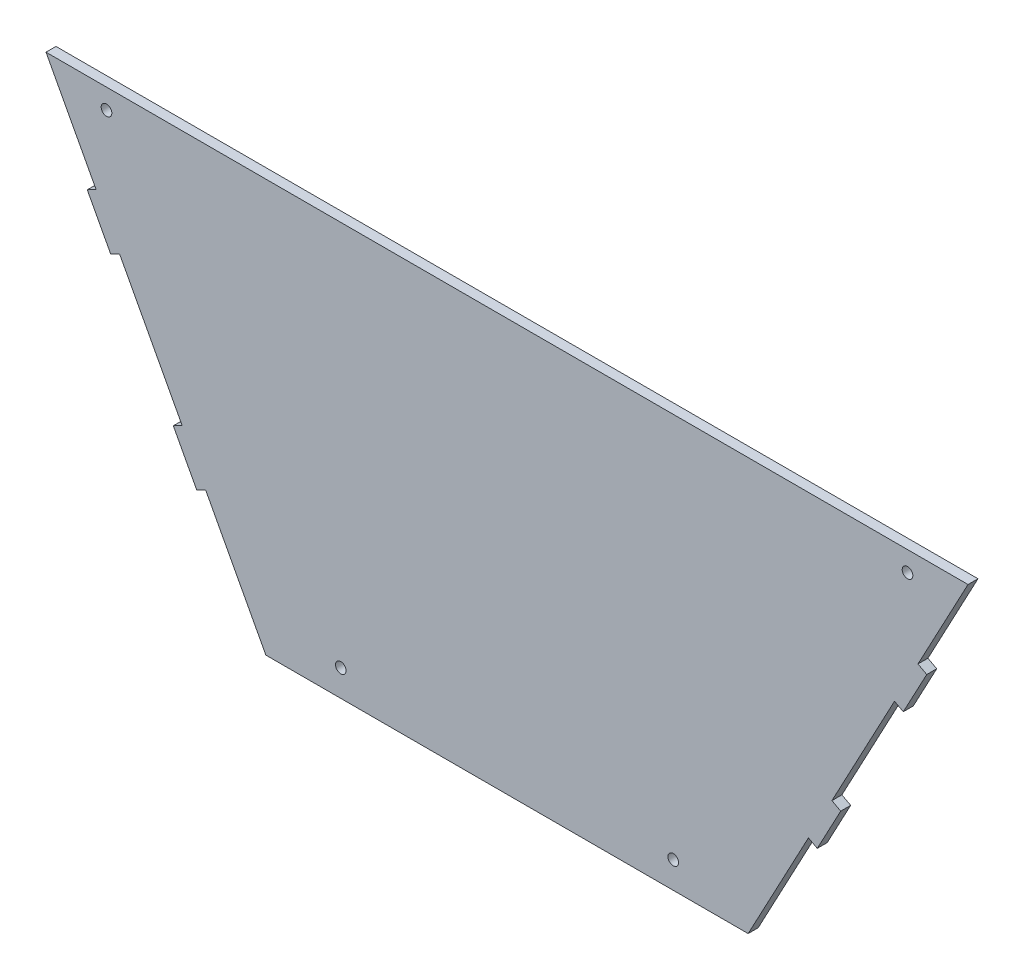
ISO-10303-21;
HEADER;
FILE_DESCRIPTION(('STEP AP214'),'2;1');
FILE_NAME('part.step','',(''),(''),'','','');
FILE_SCHEMA(('AUTOMOTIVE_DESIGN { 1 0 10303 214 1 1 1 1 }'));
ENDSEC;
DATA;
#1=APPLICATION_CONTEXT('core data for automotive mechanical design processes');
#2=APPLICATION_PROTOCOL_DEFINITION('international standard','automotive_design',2000,#1);
#3=PRODUCT_CONTEXT('',#1,'mechanical');
#4=PRODUCT('Part','Part','',(#3));
#5=PRODUCT_RELATED_PRODUCT_CATEGORY('part','',(#4));
#6=PRODUCT_DEFINITION_FORMATION('','',#4);
#7=PRODUCT_DEFINITION_CONTEXT('part definition',#1,'design');
#8=PRODUCT_DEFINITION('design','',#6,#7);
#9=PRODUCT_DEFINITION_SHAPE('','',#8);
#10=(LENGTH_UNIT() NAMED_UNIT(*) SI_UNIT(.MILLI.,.METRE.));
#11=(NAMED_UNIT(*) PLANE_ANGLE_UNIT() SI_UNIT($,.RADIAN.));
#12=(NAMED_UNIT(*) SI_UNIT($,.STERADIAN.) SOLID_ANGLE_UNIT());
#13=UNCERTAINTY_MEASURE_WITH_UNIT(LENGTH_MEASURE(1.E-05),#10,'distance_accuracy_value','');
#14=(GEOMETRIC_REPRESENTATION_CONTEXT(3) GLOBAL_UNCERTAINTY_ASSIGNED_CONTEXT((#13)) GLOBAL_UNIT_ASSIGNED_CONTEXT((#10,
#11,#12)) REPRESENTATION_CONTEXT('',''));
#15=CARTESIAN_POINT('',(0.,0.,0.));
#16=DIRECTION('',(0.,0.,1.));
#17=DIRECTION('',(1.,0.,0.));
#18=AXIS2_PLACEMENT_3D('',#15,#16,#17);
#19=CARTESIAN_POINT('',(138.666666666667,62.,3.));
#20=DIRECTION('',(-0.88235294117647,0.470588235294118,0.));
#21=DIRECTION('',(-0.470588235294118,-0.882352941176471,0.));
#22=AXIS2_PLACEMENT_3D('',#19,#20,#21);
#23=PLANE('',#22);
#24=DIRECTION('',(0.470588235294118,0.88235294117647,0.));
#25=VECTOR('',#24,1.);
#26=CARTESIAN_POINT('',(138.666666666667,62.,3.));
#27=LINE('',#26,#25);
#28=CARTESIAN_POINT('',(97.7254901960785,-14.7647058823529,3.00000000000002));
#29=VERTEX_POINT('',#28);
#30=CARTESIAN_POINT('',(116.549019607843,20.5294117647059,3.));
#31=VERTEX_POINT('',#30);
#32=EDGE_CURVE('E58',#29,#31,#27,.T.);
#33=ORIENTED_EDGE('',*,*,#32,.F.);
#34=DIRECTION('',(0.,0.,-1.));
#35=VECTOR('',#34,1.);
#36=CARTESIAN_POINT('',(97.7254901960785,-14.7647058823529,0.));
#37=LINE('',#36,#35);
#38=CARTESIAN_POINT('',(97.7254901960785,-14.7647058823529,0.));
#39=VERTEX_POINT('',#38);
#40=EDGE_CURVE('E205',#29,#39,#37,.T.);
#41=ORIENTED_EDGE('',*,*,#40,.T.);
#42=DIRECTION('',(0.470588235294118,0.88235294117647,0.));
#43=VECTOR('',#42,1.);
#44=CARTESIAN_POINT('',(138.666666666667,62.,0.));
#45=LINE('',#44,#43);
#46=CARTESIAN_POINT('',(116.549019607843,20.5294117647059,0.));
#47=VERTEX_POINT('',#46);
#48=EDGE_CURVE('E181',#39,#47,#45,.T.);
#49=ORIENTED_EDGE('',*,*,#48,.T.);
#50=DIRECTION('',(0.,0.,1.));
#51=VECTOR('',#50,1.);
#52=CARTESIAN_POINT('',(116.549019607843,20.5294117647059,0.));
#53=LINE('',#52,#51);
#54=EDGE_CURVE('E215',#47,#31,#53,.T.);
#55=ORIENTED_EDGE('',*,*,#54,.T.);
#56=EDGE_LOOP('',(#33,#41,#49,#55));
#57=FACE_BOUND('',#56,.T.);
#58=ADVANCED_FACE('F35',(#57),#23,.F.);
#59=CARTESIAN_POINT('',(123.607843137255,33.7647058823529,3.));
#60=VERTEX_POINT('',#59);
#61=CARTESIAN_POINT('',(138.666666666667,62.,3.));
#62=VERTEX_POINT('',#61);
#63=EDGE_CURVE('E322',#60,#62,#27,.T.);
#64=ORIENTED_EDGE('',*,*,#63,.F.);
#65=DIRECTION('',(0.,0.,-1.));
#66=VECTOR('',#65,1.);
#67=CARTESIAN_POINT('',(123.607843137255,33.7647058823529,0.));
#68=LINE('',#67,#66);
#69=CARTESIAN_POINT('',(123.607843137255,33.7647058823529,0.));
#70=VERTEX_POINT('',#69);
#71=EDGE_CURVE('E186',#60,#70,#68,.T.);
#72=ORIENTED_EDGE('',*,*,#71,.T.);
#73=CARTESIAN_POINT('',(138.666666666667,62.,0.));
#74=VERTEX_POINT('',#73);
#75=EDGE_CURVE('E334',#70,#74,#45,.T.);
#76=ORIENTED_EDGE('',*,*,#75,.T.);
#77=DIRECTION('',(0.,0.,-1.));
#78=VECTOR('',#77,1.);
#79=CARTESIAN_POINT('',(138.666666666667,62.,3.));
#80=LINE('',#79,#78);
#81=EDGE_CURVE('E342',#62,#74,#80,.T.);
#82=ORIENTED_EDGE('',*,*,#81,.F.);
#83=EDGE_LOOP('',(#64,#72,#76,#82));
#84=FACE_BOUND('',#83,.T.);
#85=ADVANCED_FACE('F413',(#84),#23,.F.);
#86=CARTESIAN_POINT('',(-72.5333333333333,-62.,3.));
#87=DIRECTION('',(0.88235294117647,0.470588235294118,0.));
#88=DIRECTION('',(-0.470588235294118,0.88235294117647,0.));
#89=AXIS2_PLACEMENT_3D('',#86,#87,#88);
#90=PLANE('',#89);
#91=DIRECTION('',(0.,0.,1.));
#92=VECTOR('',#91,1.);
#93=CARTESIAN_POINT('',(-90.6666666666667,-28.,0.));
#94=LINE('',#93,#92);
#95=CARTESIAN_POINT('',(-90.6666666666667,-28.,0.));
#96=VERTEX_POINT('',#95);
#97=CARTESIAN_POINT('',(-90.6666666666667,-28.,3.));
#98=VERTEX_POINT('',#97);
#99=EDGE_CURVE('E236',#96,#98,#94,.T.);
#100=ORIENTED_EDGE('',*,*,#99,.F.);
#101=DIRECTION('',(0.470588235294118,-0.88235294117647,0.));
#102=VECTOR('',#101,1.);
#103=CARTESIAN_POINT('',(-72.5333333333333,-62.,0.));
#104=LINE('',#103,#102);
#105=CARTESIAN_POINT('',(-72.5333333333333,-62.,0.));
#106=VERTEX_POINT('',#105);
#107=EDGE_CURVE('E312',#96,#106,#104,.T.);
#108=ORIENTED_EDGE('',*,*,#107,.T.);
#109=DIRECTION('',(0.,0.,-1.));
#110=VECTOR('',#109,1.);
#111=CARTESIAN_POINT('',(-72.5333333333333,-62.,3.));
#112=LINE('',#111,#110);
#113=CARTESIAN_POINT('',(-72.5333333333333,-62.,3.));
#114=VERTEX_POINT('',#113);
#115=EDGE_CURVE('E11',#114,#106,#112,.T.);
#116=ORIENTED_EDGE('',*,*,#115,.F.);
#117=DIRECTION('',(0.470588235294118,-0.88235294117647,0.));
#118=VECTOR('',#117,1.);
#119=CARTESIAN_POINT('',(-72.5333333333333,-62.,3.));
#120=LINE('',#119,#118);
#121=EDGE_CURVE('E320',#98,#114,#120,.T.);
#122=ORIENTED_EDGE('',*,*,#121,.F.);
#123=EDGE_LOOP('',(#100,#108,#116,#122));
#124=FACE_BOUND('',#123,.T.);
#125=ADVANCED_FACE('F37',(#124),#90,.F.);
#126=DIRECTION('',(0.,0.,-1.));
#127=VECTOR('',#126,1.);
#128=CARTESIAN_POINT('',(-97.7254901960785,-14.7647058823529,0.));
#129=LINE('',#128,#127);
#130=CARTESIAN_POINT('',(-97.7254901960785,-14.7647058823529,3.));
#131=VERTEX_POINT('',#130);
#132=CARTESIAN_POINT('',(-97.7254901960785,-14.7647058823529,0.));
#133=VERTEX_POINT('',#132);
#134=EDGE_CURVE('E241',#131,#133,#129,.T.);
#135=ORIENTED_EDGE('',*,*,#134,.F.);
#136=CARTESIAN_POINT('',(-116.549019607843,20.5294117647059,3.));
#137=VERTEX_POINT('',#136);
#138=EDGE_CURVE('E319',#137,#131,#120,.T.);
#139=ORIENTED_EDGE('',*,*,#138,.F.);
#140=DIRECTION('',(0.,0.,1.));
#141=VECTOR('',#140,1.);
#142=CARTESIAN_POINT('',(-116.549019607843,20.5294117647059,0.));
#143=LINE('',#142,#141);
#144=CARTESIAN_POINT('',(-116.549019607843,20.5294117647059,0.));
#145=VERTEX_POINT('',#144);
#146=EDGE_CURVE('E263',#145,#137,#143,.T.);
#147=ORIENTED_EDGE('',*,*,#146,.F.);
#148=EDGE_CURVE('E332',#145,#133,#104,.T.);
#149=ORIENTED_EDGE('',*,*,#148,.T.);
#150=EDGE_LOOP('',(#135,#139,#147,#149));
#151=FACE_BOUND('',#150,.T.);
#152=ADVANCED_FACE('F363',(#151),#90,.F.);
#153=DIRECTION('',(0.,0.,-1.));
#154=VECTOR('',#153,1.);
#155=CARTESIAN_POINT('',(-123.607843137255,33.7647058823529,0.));
#156=LINE('',#155,#154);
#157=CARTESIAN_POINT('',(-123.607843137255,33.7647058823529,3.));
#158=VERTEX_POINT('',#157);
#159=CARTESIAN_POINT('',(-123.607843137255,33.7647058823529,0.));
#160=VERTEX_POINT('',#159);
#161=EDGE_CURVE('E268',#158,#160,#156,.T.);
#162=ORIENTED_EDGE('',*,*,#161,.F.);
#163=CARTESIAN_POINT('',(-138.666666666667,62.,3.));
#164=VERTEX_POINT('',#163);
#165=EDGE_CURVE('E315',#164,#158,#120,.T.);
#166=ORIENTED_EDGE('',*,*,#165,.F.);
#167=DIRECTION('',(0.,0.,-1.));
#168=VECTOR('',#167,1.);
#169=CARTESIAN_POINT('',(-138.666666666667,62.,3.));
#170=LINE('',#169,#168);
#171=CARTESIAN_POINT('',(-138.666666666667,62.,0.));
#172=VERTEX_POINT('',#171);
#173=EDGE_CURVE('E328',#164,#172,#170,.T.);
#174=ORIENTED_EDGE('',*,*,#173,.T.);
#175=EDGE_CURVE('E329',#172,#160,#104,.T.);
#176=ORIENTED_EDGE('',*,*,#175,.T.);
#177=EDGE_LOOP('',(#162,#166,#174,#176));
#178=FACE_BOUND('',#177,.T.);
#179=ADVANCED_FACE('F390',(#178),#90,.F.);
#180=CARTESIAN_POINT('',(0.,0.,3.));
#181=DIRECTION('',(0.,0.,-1.));
#182=DIRECTION('',(-1.,0.,0.));
#183=AXIS2_PLACEMENT_3D('',#180,#181,#182);
#184=PLANE('',#183);
#185=ORIENTED_EDGE('',*,*,#165,.T.);
#186=DIRECTION('',(0.88235294117647,0.470588235294119,0.));
#187=VECTOR('',#186,1.);
#188=CARTESIAN_POINT('',(-126.254901960784,32.3529411764706,3.));
#189=LINE('',#188,#187);
#190=CARTESIAN_POINT('',(-126.254901960784,32.3529411764706,3.));
#191=VERTEX_POINT('',#190);
#192=EDGE_CURVE('E281',#191,#158,#189,.T.);
#193=ORIENTED_EDGE('',*,*,#192,.F.);
#194=DIRECTION('',(-0.470588235294119,0.88235294117647,0.));
#195=VECTOR('',#194,1.);
#196=CARTESIAN_POINT('',(-126.254901960784,32.3529411764706,3.));
#197=LINE('',#196,#195);
#198=CARTESIAN_POINT('',(-119.196078431373,19.1176470588235,3.));
#199=VERTEX_POINT('',#198);
#200=EDGE_CURVE('E270',#199,#191,#197,.T.);
#201=ORIENTED_EDGE('',*,*,#200,.F.);
#202=DIRECTION('',(0.88235294117647,0.470588235294119,0.));
#203=VECTOR('',#202,1.);
#204=CARTESIAN_POINT('',(-119.196078431373,19.1176470588235,3.));
#205=LINE('',#204,#203);
#206=EDGE_CURVE('E284',#199,#137,#205,.T.);
#207=ORIENTED_EDGE('',*,*,#206,.T.);
#208=ORIENTED_EDGE('',*,*,#138,.T.);
#209=DIRECTION('',(0.88235294117647,0.470588235294119,0.));
#210=VECTOR('',#209,1.);
#211=CARTESIAN_POINT('',(-100.372549019608,-16.1764705882353,3.00000000000002));
#212=LINE('',#211,#210);
#213=CARTESIAN_POINT('',(-100.372549019608,-16.1764705882353,3.00000000000002));
#214=VERTEX_POINT('',#213);
#215=EDGE_CURVE('E254',#214,#131,#212,.T.);
#216=ORIENTED_EDGE('',*,*,#215,.F.);
#217=DIRECTION('',(-0.470588235294119,0.88235294117647,0.));
#218=VECTOR('',#217,1.);
#219=CARTESIAN_POINT('',(-100.372549019608,-16.1764705882353,3.00000000000002));
#220=LINE('',#219,#218);
#221=CARTESIAN_POINT('',(-93.3137254901961,-29.4117647058823,3.00000000000002));
#222=VERTEX_POINT('',#221);
#223=EDGE_CURVE('E243',#222,#214,#220,.T.);
#224=ORIENTED_EDGE('',*,*,#223,.F.);
#225=DIRECTION('',(0.88235294117647,0.470588235294119,0.));
#226=VECTOR('',#225,1.);
#227=CARTESIAN_POINT('',(-93.3137254901961,-29.4117647058823,3.00000000000002));
#228=LINE('',#227,#226);
#229=EDGE_CURVE('E257',#222,#98,#228,.T.);
#230=ORIENTED_EDGE('',*,*,#229,.T.);
#231=ORIENTED_EDGE('',*,*,#121,.T.);
#232=DIRECTION('',(1.,0.,0.));
#233=VECTOR('',#232,1.);
#234=CARTESIAN_POINT('',(72.5333333333334,-62.,3.));
#235=LINE('',#234,#233);
#236=CARTESIAN_POINT('',(72.5333333333334,-62.,3.));
#237=VERTEX_POINT('',#236);
#238=EDGE_CURVE('E318',#114,#237,#235,.T.);
#239=ORIENTED_EDGE('',*,*,#238,.T.);
#240=CARTESIAN_POINT('',(90.6666666666667,-28.,3.));
#241=VERTEX_POINT('',#240);
#242=EDGE_CURVE('E323',#237,#241,#27,.T.);
#243=ORIENTED_EDGE('',*,*,#242,.T.);
#244=DIRECTION('',(-0.88235294117647,0.470588235294119,0.));
#245=VECTOR('',#244,1.);
#246=CARTESIAN_POINT('',(93.3137254901961,-29.4117647058823,3.00000000000002));
#247=LINE('',#246,#245);
#248=CARTESIAN_POINT('',(93.3137254901961,-29.4117647058823,3.00000000000002));
#249=VERTEX_POINT('',#248);
#250=EDGE_CURVE('E50',#249,#241,#247,.T.);
#251=ORIENTED_EDGE('',*,*,#250,.F.);
#252=DIRECTION('',(0.470588235294119,0.88235294117647,0.));
#253=VECTOR('',#252,1.);
#254=CARTESIAN_POINT('',(100.372549019608,-16.1764705882353,3.00000000000002));
#255=LINE('',#254,#253);
#256=CARTESIAN_POINT('',(100.372549019608,-16.1764705882353,3.00000000000002));
#257=VERTEX_POINT('',#256);
#258=EDGE_CURVE('E199',#249,#257,#255,.T.);
#259=ORIENTED_EDGE('',*,*,#258,.T.);
#260=DIRECTION('',(-0.88235294117647,0.470588235294119,0.));
#261=VECTOR('',#260,1.);
#262=CARTESIAN_POINT('',(100.372549019608,-16.1764705882353,3.00000000000002));
#263=LINE('',#262,#261);
#264=EDGE_CURVE('E187',#257,#29,#263,.T.);
#265=ORIENTED_EDGE('',*,*,#264,.T.);
#266=ORIENTED_EDGE('',*,*,#32,.T.);
#267=DIRECTION('',(-0.88235294117647,0.470588235294119,0.));
#268=VECTOR('',#267,1.);
#269=CARTESIAN_POINT('',(119.196078431373,19.1176470588235,3.));
#270=LINE('',#269,#268);
#271=CARTESIAN_POINT('',(119.196078431373,19.1176470588235,3.));
#272=VERTEX_POINT('',#271);
#273=EDGE_CURVE('E230',#272,#31,#270,.T.);
#274=ORIENTED_EDGE('',*,*,#273,.F.);
#275=DIRECTION('',(0.470588235294119,0.88235294117647,0.));
#276=VECTOR('',#275,1.);
#277=CARTESIAN_POINT('',(126.254901960784,32.3529411764706,3.));
#278=LINE('',#277,#276);
#279=CARTESIAN_POINT('',(126.254901960784,32.3529411764706,3.));
#280=VERTEX_POINT('',#279);
#281=EDGE_CURVE('E218',#272,#280,#278,.T.);
#282=ORIENTED_EDGE('',*,*,#281,.T.);
#283=DIRECTION('',(-0.88235294117647,0.470588235294119,0.));
#284=VECTOR('',#283,1.);
#285=CARTESIAN_POINT('',(126.254901960784,32.3529411764706,3.));
#286=LINE('',#285,#284);
#287=EDGE_CURVE('E232',#280,#60,#286,.T.);
#288=ORIENTED_EDGE('',*,*,#287,.T.);
#289=ORIENTED_EDGE('',*,*,#63,.T.);
#290=DIRECTION('',(-1.,0.,0.));
#291=VECTOR('',#290,1.);
#292=CARTESIAN_POINT('',(-138.666666666667,62.,3.));
#293=LINE('',#292,#291);
#294=EDGE_CURVE('E326',#62,#164,#293,.T.);
#295=ORIENTED_EDGE('',*,*,#294,.T.);
#296=EDGE_LOOP('',(#185,#193,#201,#207,#208,#216,#224,#230,#231,#239,#243,#251,#259,#265,#266,
#274,#282,#288,#289,#295));
#297=FACE_BOUND('',#296,.T.);
#298=CARTESIAN_POINT('',(-50.,-54.,3.));
#299=DIRECTION('',(0.,0.,1.));
#300=DIRECTION('',(1.,0.,0.));
#301=AXIS2_PLACEMENT_3D('',#298,#299,#300);
#302=CIRCLE('',#301,1.6);
#303=CARTESIAN_POINT('',(-48.4,-54.,3.));
#304=VERTEX_POINT('',#303);
#305=EDGE_CURVE('E309',#304,#304,#302,.T.);
#306=ORIENTED_EDGE('',*,*,#305,.F.);
#307=EDGE_LOOP('',(#306));
#308=FACE_BOUND('',#307,.T.);
#309=CARTESIAN_POINT('',(50.,-54.,3.));
#310=DIRECTION('',(0.,0.,1.));
#311=DIRECTION('',(1.,0.,0.));
#312=AXIS2_PLACEMENT_3D('',#309,#310,#311);
#313=CIRCLE('',#312,1.6);
#314=CARTESIAN_POINT('',(51.6,-54.,3.));
#315=VERTEX_POINT('',#314);
#316=EDGE_CURVE('E303',#315,#315,#313,.T.);
#317=ORIENTED_EDGE('',*,*,#316,.F.);
#318=EDGE_LOOP('',(#317));
#319=FACE_BOUND('',#318,.T.);
#320=CARTESIAN_POINT('',(-120.466666666667,56.,3.));
#321=DIRECTION('',(0.,0.,1.));
#322=DIRECTION('',(1.,0.,0.));
#323=AXIS2_PLACEMENT_3D('',#320,#321,#322);
#324=CIRCLE('',#323,1.60000000000001);
#325=CARTESIAN_POINT('',(-118.866666666667,56.,3.));
#326=VERTEX_POINT('',#325);
#327=EDGE_CURVE('E297',#326,#326,#324,.T.);
#328=ORIENTED_EDGE('',*,*,#327,.F.);
#329=EDGE_LOOP('',(#328));
#330=FACE_BOUND('',#329,.T.);
#331=CARTESIAN_POINT('',(120.466666666667,56.,3.));
#332=DIRECTION('',(0.,0.,1.));
#333=DIRECTION('',(1.,0.,0.));
#334=AXIS2_PLACEMENT_3D('',#331,#332,#333);
#335=CIRCLE('',#334,1.60000000000001);
#336=CARTESIAN_POINT('',(122.066666666667,56.,3.));
#337=VERTEX_POINT('',#336);
#338=EDGE_CURVE('E291',#337,#337,#335,.T.);
#339=ORIENTED_EDGE('',*,*,#338,.F.);
#340=EDGE_LOOP('',(#339));
#341=FACE_BOUND('',#340,.T.);
#342=ADVANCED_FACE('F354',(#297,#308,#319,#330,#341),#184,.F.);
#343=CARTESIAN_POINT('',(0.,0.,0.));
#344=DIRECTION('',(0.,0.,-1.));
#345=DIRECTION('',(-1.,0.,0.));
#346=AXIS2_PLACEMENT_3D('',#343,#344,#345);
#347=PLANE('',#346);
#348=CARTESIAN_POINT('',(-120.466666666667,56.,0.));
#349=DIRECTION('',(0.,0.,1.));
#350=DIRECTION('',(1.,0.,0.));
#351=AXIS2_PLACEMENT_3D('',#348,#349,#350);
#352=CIRCLE('',#351,1.60000000000001);
#353=CARTESIAN_POINT('',(-118.866666666667,56.,0.));
#354=VERTEX_POINT('',#353);
#355=EDGE_CURVE('E294',#354,#354,#352,.T.);
#356=ORIENTED_EDGE('',*,*,#355,.T.);
#357=EDGE_LOOP('',(#356));
#358=FACE_BOUND('',#357,.T.);
#359=CARTESIAN_POINT('',(-50.,-54.,0.));
#360=DIRECTION('',(0.,0.,1.));
#361=DIRECTION('',(1.,0.,0.));
#362=AXIS2_PLACEMENT_3D('',#359,#360,#361);
#363=CIRCLE('',#362,1.6);
#364=CARTESIAN_POINT('',(-48.4,-54.,0.));
#365=VERTEX_POINT('',#364);
#366=EDGE_CURVE('E306',#365,#365,#363,.T.);
#367=ORIENTED_EDGE('',*,*,#366,.T.);
#368=EDGE_LOOP('',(#367));
#369=FACE_BOUND('',#368,.T.);
#370=ORIENTED_EDGE('',*,*,#175,.F.);
#371=DIRECTION('',(-1.,0.,0.));
#372=VECTOR('',#371,1.);
#373=CARTESIAN_POINT('',(-138.666666666667,62.,0.));
#374=LINE('',#373,#372);
#375=EDGE_CURVE('E338',#74,#172,#374,.T.);
#376=ORIENTED_EDGE('',*,*,#375,.F.);
#377=ORIENTED_EDGE('',*,*,#75,.F.);
#378=DIRECTION('',(-0.88235294117647,0.470588235294119,0.));
#379=VECTOR('',#378,1.);
#380=CARTESIAN_POINT('',(126.254901960784,32.3529411764706,0.));
#381=LINE('',#380,#379);
#382=CARTESIAN_POINT('',(126.254901960784,32.3529411764706,0.));
#383=VERTEX_POINT('',#382);
#384=EDGE_CURVE('E234',#383,#70,#381,.T.);
#385=ORIENTED_EDGE('',*,*,#384,.F.);
#386=DIRECTION('',(-0.470588235294119,-0.88235294117647,0.));
#387=VECTOR('',#386,1.);
#388=CARTESIAN_POINT('',(126.254901960784,32.3529411764706,0.));
#389=LINE('',#388,#387);
#390=CARTESIAN_POINT('',(119.196078431373,19.1176470588235,0.));
#391=VERTEX_POINT('',#390);
#392=EDGE_CURVE('E211',#383,#391,#389,.T.);
#393=ORIENTED_EDGE('',*,*,#392,.T.);
#394=DIRECTION('',(-0.88235294117647,0.470588235294119,0.));
#395=VECTOR('',#394,1.);
#396=CARTESIAN_POINT('',(119.196078431373,19.1176470588235,0.));
#397=LINE('',#396,#395);
#398=EDGE_CURVE('E224',#391,#47,#397,.T.);
#399=ORIENTED_EDGE('',*,*,#398,.T.);
#400=ORIENTED_EDGE('',*,*,#48,.F.);
#401=DIRECTION('',(-0.88235294117647,0.470588235294119,0.));
#402=VECTOR('',#401,1.);
#403=CARTESIAN_POINT('',(100.372549019608,-16.1764705882353,0.));
#404=LINE('',#403,#402);
#405=CARTESIAN_POINT('',(100.372549019608,-16.1764705882353,0.));
#406=VERTEX_POINT('',#405);
#407=EDGE_CURVE('E173',#406,#39,#404,.T.);
#408=ORIENTED_EDGE('',*,*,#407,.F.);
#409=DIRECTION('',(-0.470588235294119,-0.88235294117647,0.));
#410=VECTOR('',#409,1.);
#411=CARTESIAN_POINT('',(100.372549019608,-16.1764705882353,0.));
#412=LINE('',#411,#410);
#413=CARTESIAN_POINT('',(93.3137254901961,-29.4117647058823,0.));
#414=VERTEX_POINT('',#413);
#415=EDGE_CURVE('E178',#406,#414,#412,.T.);
#416=ORIENTED_EDGE('',*,*,#415,.T.);
#417=DIRECTION('',(-0.88235294117647,0.470588235294119,0.));
#418=VECTOR('',#417,1.);
#419=CARTESIAN_POINT('',(93.3137254901961,-29.4117647058823,0.));
#420=LINE('',#419,#418);
#421=CARTESIAN_POINT('',(90.6666666666667,-28.,0.));
#422=VERTEX_POINT('',#421);
#423=EDGE_CURVE('E204',#414,#422,#420,.T.);
#424=ORIENTED_EDGE('',*,*,#423,.T.);
#425=CARTESIAN_POINT('',(72.5333333333334,-62.,0.));
#426=VERTEX_POINT('',#425);
#427=EDGE_CURVE('E335',#426,#422,#45,.T.);
#428=ORIENTED_EDGE('',*,*,#427,.F.);
#429=DIRECTION('',(1.,0.,0.));
#430=VECTOR('',#429,1.);
#431=CARTESIAN_POINT('',(72.5333333333334,-62.,0.));
#432=LINE('',#431,#430);
#433=EDGE_CURVE('E331',#106,#426,#432,.T.);
#434=ORIENTED_EDGE('',*,*,#433,.F.);
#435=ORIENTED_EDGE('',*,*,#107,.F.);
#436=DIRECTION('',(0.88235294117647,0.470588235294119,0.));
#437=VECTOR('',#436,1.);
#438=CARTESIAN_POINT('',(-93.3137254901961,-29.4117647058823,0.));
#439=LINE('',#438,#437);
#440=CARTESIAN_POINT('',(-93.3137254901961,-29.4117647058823,0.));
#441=VERTEX_POINT('',#440);
#442=EDGE_CURVE('E260',#441,#96,#439,.T.);
#443=ORIENTED_EDGE('',*,*,#442,.F.);
#444=DIRECTION('',(0.470588235294119,-0.88235294117647,0.));
#445=VECTOR('',#444,1.);
#446=CARTESIAN_POINT('',(-100.372549019608,-16.1764705882353,0.));
#447=LINE('',#446,#445);
#448=CARTESIAN_POINT('',(-100.372549019608,-16.1764705882353,0.));
#449=VERTEX_POINT('',#448);
#450=EDGE_CURVE('E237',#449,#441,#447,.T.);
#451=ORIENTED_EDGE('',*,*,#450,.F.);
#452=DIRECTION('',(0.88235294117647,0.470588235294119,0.));
#453=VECTOR('',#452,1.);
#454=CARTESIAN_POINT('',(-100.372549019608,-16.1764705882353,0.));
#455=LINE('',#454,#453);
#456=EDGE_CURVE('E247',#449,#133,#455,.T.);
#457=ORIENTED_EDGE('',*,*,#456,.T.);
#458=ORIENTED_EDGE('',*,*,#148,.F.);
#459=DIRECTION('',(0.88235294117647,0.470588235294119,0.));
#460=VECTOR('',#459,1.);
#461=CARTESIAN_POINT('',(-119.196078431373,19.1176470588235,0.));
#462=LINE('',#461,#460);
#463=CARTESIAN_POINT('',(-119.196078431373,19.1176470588235,0.));
#464=VERTEX_POINT('',#463);
#465=EDGE_CURVE('E287',#464,#145,#462,.T.);
#466=ORIENTED_EDGE('',*,*,#465,.F.);
#467=DIRECTION('',(0.470588235294119,-0.88235294117647,0.));
#468=VECTOR('',#467,1.);
#469=CARTESIAN_POINT('',(-126.254901960784,32.3529411764706,0.));
#470=LINE('',#469,#468);
#471=CARTESIAN_POINT('',(-126.254901960784,32.3529411764706,0.));
#472=VERTEX_POINT('',#471);
#473=EDGE_CURVE('E264',#472,#464,#470,.T.);
#474=ORIENTED_EDGE('',*,*,#473,.F.);
#475=DIRECTION('',(0.88235294117647,0.470588235294119,0.));
#476=VECTOR('',#475,1.);
#477=CARTESIAN_POINT('',(-126.254901960784,32.3529411764706,0.));
#478=LINE('',#477,#476);
#479=EDGE_CURVE('E274',#472,#160,#478,.T.);
#480=ORIENTED_EDGE('',*,*,#479,.T.);
#481=EDGE_LOOP('',(#370,#376,#377,#385,#393,#399,#400,#408,#416,#424,#428,#434,#435,#443,#451,
#457,#458,#466,#474,#480));
#482=FACE_BOUND('',#481,.T.);
#483=CARTESIAN_POINT('',(50.,-54.,0.));
#484=DIRECTION('',(0.,0.,1.));
#485=DIRECTION('',(1.,0.,0.));
#486=AXIS2_PLACEMENT_3D('',#483,#484,#485);
#487=CIRCLE('',#486,1.6);
#488=CARTESIAN_POINT('',(51.6,-54.,0.));
#489=VERTEX_POINT('',#488);
#490=EDGE_CURVE('E300',#489,#489,#487,.T.);
#491=ORIENTED_EDGE('',*,*,#490,.T.);
#492=EDGE_LOOP('',(#491));
#493=FACE_BOUND('',#492,.T.);
#494=CARTESIAN_POINT('',(120.466666666667,56.,0.));
#495=DIRECTION('',(0.,0.,1.));
#496=DIRECTION('',(1.,0.,0.));
#497=AXIS2_PLACEMENT_3D('',#494,#495,#496);
#498=CIRCLE('',#497,1.60000000000001);
#499=CARTESIAN_POINT('',(122.066666666667,56.,0.));
#500=VERTEX_POINT('',#499);
#501=EDGE_CURVE('E290',#500,#500,#498,.T.);
#502=ORIENTED_EDGE('',*,*,#501,.T.);
#503=EDGE_LOOP('',(#502));
#504=FACE_BOUND('',#503,.T.);
#505=ADVANCED_FACE('F176',(#358,#369,#482,#493,#504),#347,.T.);
#506=CARTESIAN_POINT('',(72.5333333333334,-62.,3.));
#507=DIRECTION('',(0.,1.,0.));
#508=DIRECTION('',(-1.,0.,0.));
#509=AXIS2_PLACEMENT_3D('',#506,#507,#508);
#510=PLANE('',#509);
#511=ORIENTED_EDGE('',*,*,#433,.T.);
#512=DIRECTION('',(0.,0.,-1.));
#513=VECTOR('',#512,1.);
#514=CARTESIAN_POINT('',(72.5333333333334,-62.,3.));
#515=LINE('',#514,#513);
#516=EDGE_CURVE('E43',#237,#426,#515,.T.);
#517=ORIENTED_EDGE('',*,*,#516,.F.);
#518=ORIENTED_EDGE('',*,*,#238,.F.);
#519=ORIENTED_EDGE('',*,*,#115,.T.);
#520=EDGE_LOOP('',(#511,#517,#518,#519));
#521=FACE_BOUND('',#520,.T.);
#522=ADVANCED_FACE('F357',(#521),#510,.F.);
#523=ORIENTED_EDGE('',*,*,#427,.T.);
#524=DIRECTION('',(0.,0.,1.));
#525=VECTOR('',#524,1.);
#526=CARTESIAN_POINT('',(90.6666666666667,-28.,0.));
#527=LINE('',#526,#525);
#528=EDGE_CURVE('E196',#422,#241,#527,.T.);
#529=ORIENTED_EDGE('',*,*,#528,.T.);
#530=ORIENTED_EDGE('',*,*,#242,.F.);
#531=ORIENTED_EDGE('',*,*,#516,.T.);
#532=EDGE_LOOP('',(#523,#529,#530,#531));
#533=FACE_BOUND('',#532,.T.);
#534=ADVANCED_FACE('F349',(#533),#23,.F.);
#535=CARTESIAN_POINT('',(-138.666666666667,62.,3.));
#536=DIRECTION('',(0.,-1.,0.));
#537=DIRECTION('',(1.,0.,0.));
#538=AXIS2_PLACEMENT_3D('',#535,#536,#537);
#539=PLANE('',#538);
#540=ORIENTED_EDGE('',*,*,#375,.T.);
#541=ORIENTED_EDGE('',*,*,#173,.F.);
#542=ORIENTED_EDGE('',*,*,#294,.F.);
#543=ORIENTED_EDGE('',*,*,#81,.T.);
#544=EDGE_LOOP('',(#540,#541,#542,#543));
#545=FACE_BOUND('',#544,.T.);
#546=ADVANCED_FACE('F396',(#545),#539,.F.);
#547=CARTESIAN_POINT('',(-50.,-54.,3.));
#548=DIRECTION('',(0.,0.,-1.));
#549=DIRECTION('',(-1.,0.,0.));
#550=AXIS2_PLACEMENT_3D('',#547,#548,#549);
#551=CYLINDRICAL_SURFACE('',#550,1.6);
#552=ORIENTED_EDGE('',*,*,#305,.T.);
#553=EDGE_LOOP('',(#552));
#554=FACE_BOUND('',#553,.T.);
#555=ORIENTED_EDGE('',*,*,#366,.F.);
#556=EDGE_LOOP('',(#555));
#557=FACE_BOUND('',#556,.T.);
#558=ADVANCED_FACE('F426',(#554,#557),#551,.F.);
#559=CARTESIAN_POINT('',(50.,-54.,3.));
#560=DIRECTION('',(0.,0.,-1.));
#561=DIRECTION('',(-1.,0.,0.));
#562=AXIS2_PLACEMENT_3D('',#559,#560,#561);
#563=CYLINDRICAL_SURFACE('',#562,1.6);
#564=ORIENTED_EDGE('',*,*,#316,.T.);
#565=EDGE_LOOP('',(#564));
#566=FACE_BOUND('',#565,.T.);
#567=ORIENTED_EDGE('',*,*,#490,.F.);
#568=EDGE_LOOP('',(#567));
#569=FACE_BOUND('',#568,.T.);
#570=ADVANCED_FACE('F440',(#566,#569),#563,.F.);
#571=CARTESIAN_POINT('',(-120.466666666667,56.,3.));
#572=DIRECTION('',(0.,0.,-1.));
#573=DIRECTION('',(-1.,0.,0.));
#574=AXIS2_PLACEMENT_3D('',#571,#572,#573);
#575=CYLINDRICAL_SURFACE('',#574,1.60000000000001);
#576=ORIENTED_EDGE('',*,*,#327,.T.);
#577=EDGE_LOOP('',(#576));
#578=FACE_BOUND('',#577,.T.);
#579=ORIENTED_EDGE('',*,*,#355,.F.);
#580=EDGE_LOOP('',(#579));
#581=FACE_BOUND('',#580,.T.);
#582=ADVANCED_FACE('F444',(#578,#581),#575,.F.);
#583=CARTESIAN_POINT('',(120.466666666667,56.,3.));
#584=DIRECTION('',(0.,0.,-1.));
#585=DIRECTION('',(-1.,0.,0.));
#586=AXIS2_PLACEMENT_3D('',#583,#584,#585);
#587=CYLINDRICAL_SURFACE('',#586,1.60000000000001);
#588=ORIENTED_EDGE('',*,*,#338,.T.);
#589=EDGE_LOOP('',(#588));
#590=FACE_BOUND('',#589,.T.);
#591=ORIENTED_EDGE('',*,*,#501,.F.);
#592=EDGE_LOOP('',(#591));
#593=FACE_BOUND('',#592,.T.);
#594=ADVANCED_FACE('F448',(#590,#593),#587,.F.);
#595=CARTESIAN_POINT('',(-119.196078431373,19.1176470588235,0.));
#596=DIRECTION('',(-0.470588235294119,0.88235294117647,0.));
#597=DIRECTION('',(-0.88235294117647,-0.470588235294119,0.));
#598=AXIS2_PLACEMENT_3D('',#595,#596,#597);
#599=PLANE('',#598);
#600=ORIENTED_EDGE('',*,*,#146,.T.);
#601=ORIENTED_EDGE('',*,*,#206,.F.);
#602=DIRECTION('',(0.,0.,1.));
#603=VECTOR('',#602,1.);
#604=CARTESIAN_POINT('',(-119.196078431373,19.1176470588235,0.));
#605=LINE('',#604,#603);
#606=EDGE_CURVE('E267',#464,#199,#605,.T.);
#607=ORIENTED_EDGE('',*,*,#606,.F.);
#608=ORIENTED_EDGE('',*,*,#465,.T.);
#609=EDGE_LOOP('',(#600,#601,#607,#608));
#610=FACE_BOUND('',#609,.T.);
#611=ADVANCED_FACE('F379',(#610),#599,.F.);
#612=CARTESIAN_POINT('',(-126.254901960784,32.3529411764706,0.));
#613=DIRECTION('',(0.470588235294119,-0.88235294117647,0.));
#614=DIRECTION('',(0.88235294117647,0.470588235294119,0.));
#615=AXIS2_PLACEMENT_3D('',#612,#613,#614);
#616=PLANE('',#615);
#617=ORIENTED_EDGE('',*,*,#161,.T.);
#618=ORIENTED_EDGE('',*,*,#479,.F.);
#619=DIRECTION('',(0.,0.,-1.));
#620=VECTOR('',#619,1.);
#621=CARTESIAN_POINT('',(-126.254901960784,32.3529411764706,0.));
#622=LINE('',#621,#620);
#623=EDGE_CURVE('E272',#191,#472,#622,.T.);
#624=ORIENTED_EDGE('',*,*,#623,.F.);
#625=ORIENTED_EDGE('',*,*,#192,.T.);
#626=EDGE_LOOP('',(#617,#618,#624,#625));
#627=FACE_BOUND('',#626,.T.);
#628=ADVANCED_FACE('F387',(#627),#616,.F.);
#629=CARTESIAN_POINT('',(-84.8615916955016,-45.2595155709344,0.));
#630=DIRECTION('',(-0.88235294117647,-0.470588235294119,0.));
#631=DIRECTION('',(0.470588235294119,-0.88235294117647,0.));
#632=AXIS2_PLACEMENT_3D('',#629,#630,#631);
#633=PLANE('',#632);
#634=ORIENTED_EDGE('',*,*,#473,.T.);
#635=ORIENTED_EDGE('',*,*,#606,.T.);
#636=ORIENTED_EDGE('',*,*,#200,.T.);
#637=ORIENTED_EDGE('',*,*,#623,.T.);
#638=EDGE_LOOP('',(#634,#635,#636,#637));
#639=FACE_BOUND('',#638,.T.);
#640=ADVANCED_FACE('F383',(#639),#633,.T.);
#641=CARTESIAN_POINT('',(-93.3137254901961,-29.4117647058823,0.));
#642=DIRECTION('',(-0.470588235294119,0.88235294117647,0.));
#643=DIRECTION('',(-0.88235294117647,-0.470588235294119,0.));
#644=AXIS2_PLACEMENT_3D('',#641,#642,#643);
#645=PLANE('',#644);
#646=ORIENTED_EDGE('',*,*,#99,.T.);
#647=ORIENTED_EDGE('',*,*,#229,.F.);
#648=DIRECTION('',(0.,0.,1.));
#649=VECTOR('',#648,1.);
#650=CARTESIAN_POINT('',(-93.3137254901961,-29.4117647058823,0.));
#651=LINE('',#650,#649);
#652=EDGE_CURVE('E240',#441,#222,#651,.T.);
#653=ORIENTED_EDGE('',*,*,#652,.F.);
#654=ORIENTED_EDGE('',*,*,#442,.T.);
#655=EDGE_LOOP('',(#646,#647,#653,#654));
#656=FACE_BOUND('',#655,.T.);
#657=ADVANCED_FACE('F459',(#656),#645,.F.);
#658=CARTESIAN_POINT('',(-100.372549019608,-16.1764705882353,0.));
#659=DIRECTION('',(0.470588235294119,-0.88235294117647,0.));
#660=DIRECTION('',(0.88235294117647,0.470588235294119,0.));
#661=AXIS2_PLACEMENT_3D('',#658,#659,#660);
#662=PLANE('',#661);
#663=ORIENTED_EDGE('',*,*,#134,.T.);
#664=ORIENTED_EDGE('',*,*,#456,.F.);
#665=DIRECTION('',(0.,0.,-1.));
#666=VECTOR('',#665,1.);
#667=CARTESIAN_POINT('',(-100.372549019608,-16.1764705882353,0.));
#668=LINE('',#667,#666);
#669=EDGE_CURVE('E245',#214,#449,#668,.T.);
#670=ORIENTED_EDGE('',*,*,#669,.F.);
#671=ORIENTED_EDGE('',*,*,#215,.T.);
#672=EDGE_LOOP('',(#663,#664,#670,#671));
#673=FACE_BOUND('',#672,.T.);
#674=ADVANCED_FACE('F368',(#673),#662,.F.);
#675=CARTESIAN_POINT('',(-84.8615916955017,-45.2595155709344,0.));
#676=DIRECTION('',(-0.88235294117647,-0.470588235294119,0.));
#677=DIRECTION('',(0.470588235294119,-0.88235294117647,0.));
#678=AXIS2_PLACEMENT_3D('',#675,#676,#677);
#679=PLANE('',#678);
#680=ORIENTED_EDGE('',*,*,#450,.T.);
#681=ORIENTED_EDGE('',*,*,#652,.T.);
#682=ORIENTED_EDGE('',*,*,#223,.T.);
#683=ORIENTED_EDGE('',*,*,#669,.T.);
#684=EDGE_LOOP('',(#680,#681,#682,#683));
#685=FACE_BOUND('',#684,.T.);
#686=ADVANCED_FACE('F373',(#685),#679,.T.);
#687=CARTESIAN_POINT('',(126.254901960784,32.3529411764706,0.));
#688=DIRECTION('',(0.470588235294119,0.88235294117647,0.));
#689=DIRECTION('',(-0.88235294117647,0.470588235294119,0.));
#690=AXIS2_PLACEMENT_3D('',#687,#688,#689);
#691=PLANE('',#690);
#692=ORIENTED_EDGE('',*,*,#71,.F.);
#693=ORIENTED_EDGE('',*,*,#287,.F.);
#694=DIRECTION('',(0.,0.,-1.));
#695=VECTOR('',#694,1.);
#696=CARTESIAN_POINT('',(126.254901960784,32.3529411764706,0.));
#697=LINE('',#696,#695);
#698=EDGE_CURVE('E214',#280,#383,#697,.T.);
#699=ORIENTED_EDGE('',*,*,#698,.T.);
#700=ORIENTED_EDGE('',*,*,#384,.T.);
#701=EDGE_LOOP('',(#692,#693,#699,#700));
#702=FACE_BOUND('',#701,.T.);
#703=ADVANCED_FACE('F412',(#702),#691,.T.);
#704=CARTESIAN_POINT('',(119.196078431373,19.1176470588235,0.));
#705=DIRECTION('',(-0.470588235294119,-0.88235294117647,0.));
#706=DIRECTION('',(0.88235294117647,-0.470588235294119,0.));
#707=AXIS2_PLACEMENT_3D('',#704,#705,#706);
#708=PLANE('',#707);
#709=ORIENTED_EDGE('',*,*,#54,.F.);
#710=ORIENTED_EDGE('',*,*,#398,.F.);
#711=DIRECTION('',(0.,0.,1.));
#712=VECTOR('',#711,1.);
#713=CARTESIAN_POINT('',(119.196078431373,19.1176470588235,0.));
#714=LINE('',#713,#712);
#715=EDGE_CURVE('E221',#391,#272,#714,.T.);
#716=ORIENTED_EDGE('',*,*,#715,.T.);
#717=ORIENTED_EDGE('',*,*,#273,.T.);
#718=EDGE_LOOP('',(#709,#710,#716,#717));
#719=FACE_BOUND('',#718,.T.);
#720=ADVANCED_FACE('F405',(#719),#708,.T.);
#721=CARTESIAN_POINT('',(84.8615916955016,-45.2595155709344,0.));
#722=DIRECTION('',(0.88235294117647,-0.470588235294119,0.));
#723=DIRECTION('',(-0.470588235294119,-0.88235294117647,0.));
#724=AXIS2_PLACEMENT_3D('',#721,#722,#723);
#725=PLANE('',#724);
#726=ORIENTED_EDGE('',*,*,#392,.F.);
#727=ORIENTED_EDGE('',*,*,#698,.F.);
#728=ORIENTED_EDGE('',*,*,#281,.F.);
#729=ORIENTED_EDGE('',*,*,#715,.F.);
#730=EDGE_LOOP('',(#726,#727,#728,#729));
#731=FACE_BOUND('',#730,.T.);
#732=ADVANCED_FACE('F409',(#731),#725,.T.);
#733=CARTESIAN_POINT('',(100.372549019608,-16.1764705882353,0.));
#734=DIRECTION('',(0.470588235294119,0.88235294117647,0.));
#735=DIRECTION('',(-0.88235294117647,0.470588235294119,0.));
#736=AXIS2_PLACEMENT_3D('',#733,#734,#735);
#737=PLANE('',#736);
#738=ORIENTED_EDGE('',*,*,#40,.F.);
#739=ORIENTED_EDGE('',*,*,#264,.F.);
#740=DIRECTION('',(0.,0.,-1.));
#741=VECTOR('',#740,1.);
#742=CARTESIAN_POINT('',(100.372549019608,-16.1764705882353,0.));
#743=LINE('',#742,#741);
#744=EDGE_CURVE('E193',#257,#406,#743,.T.);
#745=ORIENTED_EDGE('',*,*,#744,.T.);
#746=ORIENTED_EDGE('',*,*,#407,.T.);
#747=EDGE_LOOP('',(#738,#739,#745,#746));
#748=FACE_BOUND('',#747,.T.);
#749=ADVANCED_FACE('F198',(#748),#737,.T.);
#750=CARTESIAN_POINT('',(93.3137254901961,-29.4117647058823,0.));
#751=DIRECTION('',(-0.470588235294119,-0.88235294117647,0.));
#752=DIRECTION('',(0.88235294117647,-0.470588235294119,0.));
#753=AXIS2_PLACEMENT_3D('',#750,#751,#752);
#754=PLANE('',#753);
#755=ORIENTED_EDGE('',*,*,#528,.F.);
#756=ORIENTED_EDGE('',*,*,#423,.F.);
#757=DIRECTION('',(0.,0.,1.));
#758=VECTOR('',#757,1.);
#759=CARTESIAN_POINT('',(93.3137254901961,-29.4117647058823,0.));
#760=LINE('',#759,#758);
#761=EDGE_CURVE('E195',#414,#249,#760,.T.);
#762=ORIENTED_EDGE('',*,*,#761,.T.);
#763=ORIENTED_EDGE('',*,*,#250,.T.);
#764=EDGE_LOOP('',(#755,#756,#762,#763));
#765=FACE_BOUND('',#764,.T.);
#766=ADVANCED_FACE('F353',(#765),#754,.T.);
#767=CARTESIAN_POINT('',(84.8615916955017,-45.2595155709344,0.));
#768=DIRECTION('',(0.88235294117647,-0.470588235294119,0.));
#769=DIRECTION('',(-0.470588235294119,-0.88235294117647,0.));
#770=AXIS2_PLACEMENT_3D('',#767,#768,#769);
#771=PLANE('',#770);
#772=ORIENTED_EDGE('',*,*,#415,.F.);
#773=ORIENTED_EDGE('',*,*,#744,.F.);
#774=ORIENTED_EDGE('',*,*,#258,.F.);
#775=ORIENTED_EDGE('',*,*,#761,.F.);
#776=EDGE_LOOP('',(#772,#773,#774,#775));
#777=FACE_BOUND('',#776,.T.);
#778=ADVANCED_FACE('F191',(#777),#771,.T.);
#779=CLOSED_SHELL('',(#58,#85,#125,#152,#179,#342,#505,#522,#534,#546,#558,#570,#582,#594,#611,
#628,#640,#657,#674,#686,#703,#720,#732,#749,#766,#778));
#780=MANIFOLD_SOLID_BREP('B2',#779);
#781=ADVANCED_BREP_SHAPE_REPRESENTATION('',(#18,#780),#14);
#782=SHAPE_DEFINITION_REPRESENTATION(#9,#781);
ENDSEC;
END-ISO-10303-21;
